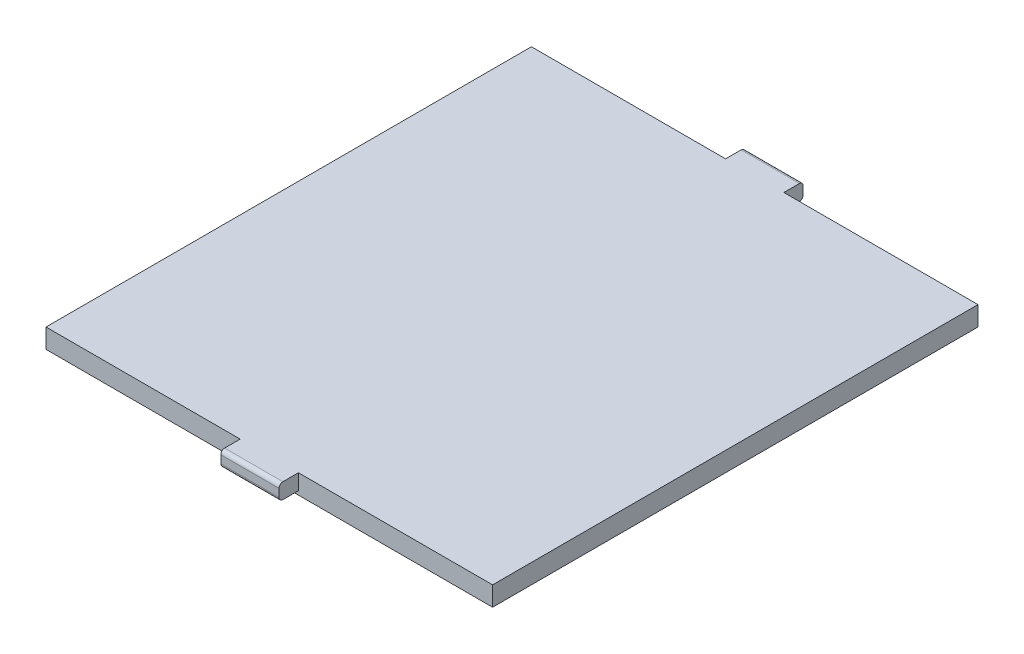
ISO-10303-21;
HEADER;
FILE_DESCRIPTION(('STEP AP214'),'2;1');
FILE_NAME('part.step','',(''),(''),'','','');
FILE_SCHEMA(('AUTOMOTIVE_DESIGN { 1 0 10303 214 1 1 1 1 }'));
ENDSEC;
DATA;
#1=APPLICATION_CONTEXT('core data for automotive mechanical design processes');
#2=APPLICATION_PROTOCOL_DEFINITION('international standard','automotive_design',2000,#1);
#3=PRODUCT_CONTEXT('',#1,'mechanical');
#4=PRODUCT('Part','Part','',(#3));
#5=PRODUCT_RELATED_PRODUCT_CATEGORY('part','',(#4));
#6=PRODUCT_DEFINITION_FORMATION('','',#4);
#7=PRODUCT_DEFINITION_CONTEXT('part definition',#1,'design');
#8=PRODUCT_DEFINITION('design','',#6,#7);
#9=PRODUCT_DEFINITION_SHAPE('','',#8);
#10=(LENGTH_UNIT() NAMED_UNIT(*) SI_UNIT(.MILLI.,.METRE.));
#11=(NAMED_UNIT(*) PLANE_ANGLE_UNIT() SI_UNIT($,.RADIAN.));
#12=(NAMED_UNIT(*) SI_UNIT($,.STERADIAN.) SOLID_ANGLE_UNIT());
#13=UNCERTAINTY_MEASURE_WITH_UNIT(LENGTH_MEASURE(1.E-05),#10,'distance_accuracy_value','');
#14=(GEOMETRIC_REPRESENTATION_CONTEXT(3) GLOBAL_UNCERTAINTY_ASSIGNED_CONTEXT((#13)) GLOBAL_UNIT_ASSIGNED_CONTEXT((#10,
#11,#12)) REPRESENTATION_CONTEXT('',''));
#15=CARTESIAN_POINT('',(0.,0.,0.));
#16=DIRECTION('',(0.,0.,1.));
#17=DIRECTION('',(1.,0.,0.));
#18=AXIS2_PLACEMENT_3D('',#15,#16,#17);
#19=CARTESIAN_POINT('',(0.,25.4,-635.));
#20=DIRECTION('',(0.,0.,1.));
#21=DIRECTION('',(1.,0.,0.));
#22=AXIS2_PLACEMENT_3D('',#19,#20,#21);
#23=PLANE('',#22);
#24=DIRECTION('',(0.,-1.,0.));
#25=VECTOR('',#24,1.);
#26=CARTESIAN_POINT('',(330.2,25.4,-635.));
#27=LINE('',#26,#25);
#28=CARTESIAN_POINT('',(330.2,25.4,-635.));
#29=VERTEX_POINT('',#28);
#30=CARTESIAN_POINT('',(330.2,5.08,-635.));
#31=VERTEX_POINT('',#30);
#32=EDGE_CURVE('E168',#29,#31,#27,.T.);
#33=ORIENTED_EDGE('',*,*,#32,.F.);
#34=DIRECTION('',(-1.,0.,0.));
#35=VECTOR('',#34,1.);
#36=CARTESIAN_POINT('',(0.,25.4,-635.));
#37=LINE('',#36,#35);
#38=CARTESIAN_POINT('',(584.2,25.4,-635.));
#39=VERTEX_POINT('',#38);
#40=EDGE_CURVE('E211',#39,#29,#37,.T.);
#41=ORIENTED_EDGE('',*,*,#40,.F.);
#42=DIRECTION('',(0.,-1.,0.));
#43=VECTOR('',#42,1.);
#44=CARTESIAN_POINT('',(584.2,25.4,-635.));
#45=LINE('',#44,#43);
#46=CARTESIAN_POINT('',(584.2,0.,-635.));
#47=VERTEX_POINT('',#46);
#48=EDGE_CURVE('E224',#39,#47,#45,.T.);
#49=ORIENTED_EDGE('',*,*,#48,.T.);
#50=DIRECTION('',(-1.,0.,0.));
#51=VECTOR('',#50,1.);
#52=CARTESIAN_POINT('',(0.,0.,-635.));
#53=LINE('',#52,#51);
#54=CARTESIAN_POINT('',(0.,0.,-635.));
#55=VERTEX_POINT('',#54);
#56=EDGE_CURVE('E205',#47,#55,#53,.T.);
#57=ORIENTED_EDGE('',*,*,#56,.T.);
#58=DIRECTION('',(0.,-1.,0.));
#59=VECTOR('',#58,1.);
#60=CARTESIAN_POINT('',(0.,25.4,-635.));
#61=LINE('',#60,#59);
#62=CARTESIAN_POINT('',(0.,25.4,-635.));
#63=VERTEX_POINT('',#62);
#64=EDGE_CURVE('E214',#63,#55,#61,.T.);
#65=ORIENTED_EDGE('',*,*,#64,.F.);
#66=CARTESIAN_POINT('',(254.,25.4,-635.));
#67=VERTEX_POINT('',#66);
#68=EDGE_CURVE('E163',#67,#63,#37,.T.);
#69=ORIENTED_EDGE('',*,*,#68,.F.);
#70=DIRECTION('',(0.,1.,0.));
#71=VECTOR('',#70,1.);
#72=CARTESIAN_POINT('',(254.,25.4,-635.));
#73=LINE('',#72,#71);
#74=CARTESIAN_POINT('',(254.,5.08,-635.));
#75=VERTEX_POINT('',#74);
#76=EDGE_CURVE('E148',#75,#67,#73,.T.);
#77=ORIENTED_EDGE('',*,*,#76,.F.);
#78=DIRECTION('',(-1.,0.,0.));
#79=VECTOR('',#78,1.);
#80=CARTESIAN_POINT('',(330.2,5.08,-635.));
#81=LINE('',#80,#79);
#82=EDGE_CURVE('E160',#31,#75,#81,.T.);
#83=ORIENTED_EDGE('',*,*,#82,.F.);
#84=EDGE_LOOP('',(#33,#41,#49,#57,#65,#69,#77,#83));
#85=FACE_BOUND('',#84,.T.);
#86=ADVANCED_FACE('F32',(#85),#23,.F.);
#87=CARTESIAN_POINT('',(0.,25.4,0.));
#88=DIRECTION('',(0.,0.,-1.));
#89=DIRECTION('',(-1.,0.,0.));
#90=AXIS2_PLACEMENT_3D('',#87,#88,#89);
#91=PLANE('',#90);
#92=DIRECTION('',(0.,-1.,0.));
#93=VECTOR('',#92,1.);
#94=CARTESIAN_POINT('',(254.,25.4,0.));
#95=LINE('',#94,#93);
#96=CARTESIAN_POINT('',(254.,25.4,0.));
#97=VERTEX_POINT('',#96);
#98=CARTESIAN_POINT('',(254.,5.08,0.));
#99=VERTEX_POINT('',#98);
#100=EDGE_CURVE('E178',#97,#99,#95,.T.);
#101=ORIENTED_EDGE('',*,*,#100,.F.);
#102=DIRECTION('',(1.,0.,0.));
#103=VECTOR('',#102,1.);
#104=CARTESIAN_POINT('',(0.,25.4,0.));
#105=LINE('',#104,#103);
#106=CARTESIAN_POINT('',(0.,25.4,0.));
#107=VERTEX_POINT('',#106);
#108=EDGE_CURVE('E206',#107,#97,#105,.T.);
#109=ORIENTED_EDGE('',*,*,#108,.F.);
#110=DIRECTION('',(0.,-1.,0.));
#111=VECTOR('',#110,1.);
#112=CARTESIAN_POINT('',(0.,25.4,0.));
#113=LINE('',#112,#111);
#114=CARTESIAN_POINT('',(0.,0.,0.));
#115=VERTEX_POINT('',#114);
#116=EDGE_CURVE('E230',#107,#115,#113,.T.);
#117=ORIENTED_EDGE('',*,*,#116,.T.);
#118=DIRECTION('',(1.,0.,0.));
#119=VECTOR('',#118,1.);
#120=CARTESIAN_POINT('',(0.,0.,0.));
#121=LINE('',#120,#119);
#122=CARTESIAN_POINT('',(584.2,0.,0.));
#123=VERTEX_POINT('',#122);
#124=EDGE_CURVE('E217',#115,#123,#121,.T.);
#125=ORIENTED_EDGE('',*,*,#124,.T.);
#126=DIRECTION('',(0.,-1.,0.));
#127=VECTOR('',#126,1.);
#128=CARTESIAN_POINT('',(584.2,25.4,0.));
#129=LINE('',#128,#127);
#130=CARTESIAN_POINT('',(584.2,25.4,0.));
#131=VERTEX_POINT('',#130);
#132=EDGE_CURVE('E227',#131,#123,#129,.T.);
#133=ORIENTED_EDGE('',*,*,#132,.F.);
#134=CARTESIAN_POINT('',(330.2,25.4,0.));
#135=VERTEX_POINT('',#134);
#136=EDGE_CURVE('E204',#135,#131,#105,.T.);
#137=ORIENTED_EDGE('',*,*,#136,.F.);
#138=DIRECTION('',(0.,1.,0.));
#139=VECTOR('',#138,1.);
#140=CARTESIAN_POINT('',(330.2,25.4,0.));
#141=LINE('',#140,#139);
#142=CARTESIAN_POINT('',(330.2,5.08,0.));
#143=VERTEX_POINT('',#142);
#144=EDGE_CURVE('E182',#143,#135,#141,.T.);
#145=ORIENTED_EDGE('',*,*,#144,.F.);
#146=DIRECTION('',(1.,0.,0.));
#147=VECTOR('',#146,1.);
#148=CARTESIAN_POINT('',(254.,5.08,0.));
#149=LINE('',#148,#147);
#150=EDGE_CURVE('E188',#99,#143,#149,.T.);
#151=ORIENTED_EDGE('',*,*,#150,.F.);
#152=EDGE_LOOP('',(#101,#109,#117,#125,#133,#137,#145,#151));
#153=FACE_BOUND('',#152,.T.);
#154=ADVANCED_FACE('F286',(#153),#91,.F.);
#155=CARTESIAN_POINT('',(0.,25.4,0.));
#156=DIRECTION('',(1.,0.,0.));
#157=DIRECTION('',(0.,0.,-1.));
#158=AXIS2_PLACEMENT_3D('',#155,#156,#157);
#159=PLANE('',#158);
#160=DIRECTION('',(0.,0.,1.));
#161=VECTOR('',#160,1.);
#162=CARTESIAN_POINT('',(0.,0.,0.));
#163=LINE('',#162,#161);
#164=EDGE_CURVE('E200',#55,#115,#163,.T.);
#165=ORIENTED_EDGE('',*,*,#164,.T.);
#166=ORIENTED_EDGE('',*,*,#116,.F.);
#167=DIRECTION('',(0.,0.,1.));
#168=VECTOR('',#167,1.);
#169=CARTESIAN_POINT('',(0.,25.4,0.));
#170=LINE('',#169,#168);
#171=EDGE_CURVE('E201',#63,#107,#170,.T.);
#172=ORIENTED_EDGE('',*,*,#171,.F.);
#173=ORIENTED_EDGE('',*,*,#64,.T.);
#174=EDGE_LOOP('',(#165,#166,#172,#173));
#175=FACE_BOUND('',#174,.T.);
#176=ADVANCED_FACE('F291',(#175),#159,.F.);
#177=CARTESIAN_POINT('',(584.2,25.4,0.));
#178=DIRECTION('',(-1.,0.,0.));
#179=DIRECTION('',(0.,0.,1.));
#180=AXIS2_PLACEMENT_3D('',#177,#178,#179);
#181=PLANE('',#180);
#182=DIRECTION('',(0.,0.,-1.));
#183=VECTOR('',#182,1.);
#184=CARTESIAN_POINT('',(584.2,0.,0.));
#185=LINE('',#184,#183);
#186=EDGE_CURVE('E219',#123,#47,#185,.T.);
#187=ORIENTED_EDGE('',*,*,#186,.T.);
#188=ORIENTED_EDGE('',*,*,#48,.F.);
#189=DIRECTION('',(0.,0.,-1.));
#190=VECTOR('',#189,1.);
#191=CARTESIAN_POINT('',(584.2,25.4,0.));
#192=LINE('',#191,#190);
#193=EDGE_CURVE('E209',#131,#39,#192,.T.);
#194=ORIENTED_EDGE('',*,*,#193,.F.);
#195=ORIENTED_EDGE('',*,*,#132,.T.);
#196=EDGE_LOOP('',(#187,#188,#194,#195));
#197=FACE_BOUND('',#196,.T.);
#198=ADVANCED_FACE('F298',(#197),#181,.F.);
#199=CARTESIAN_POINT('',(0.,25.4,0.));
#200=DIRECTION('',(0.,-1.,0.));
#201=DIRECTION('',(0.,0.,-1.));
#202=AXIS2_PLACEMENT_3D('',#199,#200,#201);
#203=PLANE('',#202);
#204=DIRECTION('',(0.,0.,-1.));
#205=VECTOR('',#204,1.);
#206=CARTESIAN_POINT('',(254.,25.4,25.4));
#207=LINE('',#206,#205);
#208=CARTESIAN_POINT('',(254.,25.4,20.32));
#209=VERTEX_POINT('',#208);
#210=EDGE_CURVE('E185',#209,#97,#207,.T.);
#211=ORIENTED_EDGE('',*,*,#210,.F.);
#212=DIRECTION('',(-1.,0.,0.));
#213=VECTOR('',#212,1.);
#214=CARTESIAN_POINT('',(330.2,25.4,20.32));
#215=LINE('',#214,#213);
#216=CARTESIAN_POINT('',(330.2,25.4,20.32));
#217=VERTEX_POINT('',#216);
#218=EDGE_CURVE('E40',#209,#217,#215,.F.);
#219=ORIENTED_EDGE('',*,*,#218,.T.);
#220=DIRECTION('',(0.,0.,-1.));
#221=VECTOR('',#220,1.);
#222=CARTESIAN_POINT('',(330.2,25.4,25.4));
#223=LINE('',#222,#221);
#224=EDGE_CURVE('E194',#217,#135,#223,.T.);
#225=ORIENTED_EDGE('',*,*,#224,.T.);
#226=ORIENTED_EDGE('',*,*,#136,.T.);
#227=ORIENTED_EDGE('',*,*,#193,.T.);
#228=ORIENTED_EDGE('',*,*,#40,.T.);
#229=DIRECTION('',(0.,0.,1.));
#230=VECTOR('',#229,1.);
#231=CARTESIAN_POINT('',(330.2,25.4,-660.4));
#232=LINE('',#231,#230);
#233=CARTESIAN_POINT('',(330.2,25.4,-655.32));
#234=VERTEX_POINT('',#233);
#235=EDGE_CURVE('E173',#234,#29,#232,.T.);
#236=ORIENTED_EDGE('',*,*,#235,.F.);
#237=DIRECTION('',(1.,0.,0.));
#238=VECTOR('',#237,1.);
#239=CARTESIAN_POINT('',(254.,25.4,-655.32));
#240=LINE('',#239,#238);
#241=CARTESIAN_POINT('',(254.,25.4,-655.32));
#242=VERTEX_POINT('',#241);
#243=EDGE_CURVE('E238',#234,#242,#240,.F.);
#244=ORIENTED_EDGE('',*,*,#243,.T.);
#245=DIRECTION('',(0.,0.,1.));
#246=VECTOR('',#245,1.);
#247=CARTESIAN_POINT('',(254.,25.4,-660.4));
#248=LINE('',#247,#246);
#249=EDGE_CURVE('E154',#242,#67,#248,.T.);
#250=ORIENTED_EDGE('',*,*,#249,.T.);
#251=ORIENTED_EDGE('',*,*,#68,.T.);
#252=ORIENTED_EDGE('',*,*,#171,.T.);
#253=ORIENTED_EDGE('',*,*,#108,.T.);
#254=EDGE_LOOP('',(#211,#219,#225,#226,#227,#228,#236,#244,#250,#251,#252,#253));
#255=FACE_BOUND('',#254,.T.);
#256=ADVANCED_FACE('F300',(#255),#203,.F.);
#257=CARTESIAN_POINT('',(0.,0.,0.));
#258=DIRECTION('',(0.,-1.,0.));
#259=DIRECTION('',(0.,0.,-1.));
#260=AXIS2_PLACEMENT_3D('',#257,#258,#259);
#261=PLANE('',#260);
#262=ORIENTED_EDGE('',*,*,#164,.F.);
#263=ORIENTED_EDGE('',*,*,#56,.F.);
#264=ORIENTED_EDGE('',*,*,#186,.F.);
#265=ORIENTED_EDGE('',*,*,#124,.F.);
#266=EDGE_LOOP('',(#262,#263,#264,#265));
#267=FACE_BOUND('',#266,.T.);
#268=ADVANCED_FACE('F296',(#267),#261,.T.);
#269=CARTESIAN_POINT('',(254.,25.4,25.4));
#270=DIRECTION('',(1.,0.,0.));
#271=DIRECTION('',(0.,0.,-1.));
#272=AXIS2_PLACEMENT_3D('',#269,#270,#271);
#273=PLANE('',#272);
#274=DIRECTION('',(0.,-1.,0.));
#275=VECTOR('',#274,1.);
#276=CARTESIAN_POINT('',(254.,25.4,25.4));
#277=LINE('',#276,#275);
#278=CARTESIAN_POINT('',(254.,20.32,25.4));
#279=VERTEX_POINT('',#278);
#280=CARTESIAN_POINT('',(254.,10.16,25.4));
#281=VERTEX_POINT('',#280);
#282=EDGE_CURVE('E179',#279,#281,#277,.T.);
#283=ORIENTED_EDGE('',*,*,#282,.F.);
#284=CARTESIAN_POINT('',(254.,20.32,20.32));
#285=DIRECTION('',(1.,0.,0.));
#286=DIRECTION('',(0.,0.,-1.));
#287=AXIS2_PLACEMENT_3D('',#284,#285,#286);
#288=CIRCLE('',#287,5.08);
#289=EDGE_CURVE('E54',#279,#209,#288,.F.);
#290=ORIENTED_EDGE('',*,*,#289,.T.);
#291=ORIENTED_EDGE('',*,*,#210,.T.);
#292=ORIENTED_EDGE('',*,*,#100,.T.);
#293=DIRECTION('',(0.,0.,-1.));
#294=VECTOR('',#293,1.);
#295=CARTESIAN_POINT('',(254.,5.08,25.4));
#296=LINE('',#295,#294);
#297=CARTESIAN_POINT('',(254.,5.08,20.32));
#298=VERTEX_POINT('',#297);
#299=EDGE_CURVE('E198',#298,#99,#296,.T.);
#300=ORIENTED_EDGE('',*,*,#299,.F.);
#301=CARTESIAN_POINT('',(254.,10.16,20.32));
#302=DIRECTION('',(1.,0.,0.));
#303=DIRECTION('',(0.,0.,-1.));
#304=AXIS2_PLACEMENT_3D('',#301,#302,#303);
#305=CIRCLE('',#304,5.08);
#306=EDGE_CURVE('E258',#298,#281,#305,.F.);
#307=ORIENTED_EDGE('',*,*,#306,.T.);
#308=EDGE_LOOP('',(#283,#290,#291,#292,#300,#307));
#309=FACE_BOUND('',#308,.T.);
#310=ADVANCED_FACE('F270',(#309),#273,.F.);
#311=CARTESIAN_POINT('',(254.,5.08,25.4));
#312=DIRECTION('',(0.,1.,0.));
#313=DIRECTION('',(0.,0.,1.));
#314=AXIS2_PLACEMENT_3D('',#311,#312,#313);
#315=PLANE('',#314);
#316=DIRECTION('',(0.,0.,-1.));
#317=VECTOR('',#316,1.);
#318=CARTESIAN_POINT('',(330.2,5.08,25.4));
#319=LINE('',#318,#317);
#320=CARTESIAN_POINT('',(330.2,5.08,20.32));
#321=VERTEX_POINT('',#320);
#322=EDGE_CURVE('E196',#321,#143,#319,.T.);
#323=ORIENTED_EDGE('',*,*,#322,.F.);
#324=DIRECTION('',(1.,0.,0.));
#325=VECTOR('',#324,1.);
#326=CARTESIAN_POINT('',(254.,5.08,20.32));
#327=LINE('',#326,#325);
#328=EDGE_CURVE('E256',#321,#298,#327,.F.);
#329=ORIENTED_EDGE('',*,*,#328,.T.);
#330=ORIENTED_EDGE('',*,*,#299,.T.);
#331=ORIENTED_EDGE('',*,*,#150,.T.);
#332=EDGE_LOOP('',(#323,#329,#330,#331));
#333=FACE_BOUND('',#332,.T.);
#334=ADVANCED_FACE('F341',(#333),#315,.F.);
#335=CARTESIAN_POINT('',(330.2,25.4,25.4));
#336=DIRECTION('',(-1.,0.,0.));
#337=DIRECTION('',(0.,0.,1.));
#338=AXIS2_PLACEMENT_3D('',#335,#336,#337);
#339=PLANE('',#338);
#340=ORIENTED_EDGE('',*,*,#224,.F.);
#341=CARTESIAN_POINT('',(330.2,20.32,20.32));
#342=DIRECTION('',(-1.,0.,0.));
#343=DIRECTION('',(0.,0.,1.));
#344=AXIS2_PLACEMENT_3D('',#341,#342,#343);
#345=CIRCLE('',#344,5.08);
#346=CARTESIAN_POINT('',(330.2,20.32,25.4));
#347=VERTEX_POINT('',#346);
#348=EDGE_CURVE('E11',#217,#347,#345,.F.);
#349=ORIENTED_EDGE('',*,*,#348,.T.);
#350=DIRECTION('',(0.,1.,0.));
#351=VECTOR('',#350,1.);
#352=CARTESIAN_POINT('',(330.2,25.4,25.4));
#353=LINE('',#352,#351);
#354=CARTESIAN_POINT('',(330.2,10.16,25.4));
#355=VERTEX_POINT('',#354);
#356=EDGE_CURVE('E181',#355,#347,#353,.T.);
#357=ORIENTED_EDGE('',*,*,#356,.F.);
#358=CARTESIAN_POINT('',(330.2,10.16,20.32));
#359=DIRECTION('',(-1.,0.,0.));
#360=DIRECTION('',(0.,0.,1.));
#361=AXIS2_PLACEMENT_3D('',#358,#359,#360);
#362=CIRCLE('',#361,5.08);
#363=EDGE_CURVE('E254',#355,#321,#362,.F.);
#364=ORIENTED_EDGE('',*,*,#363,.T.);
#365=ORIENTED_EDGE('',*,*,#322,.T.);
#366=ORIENTED_EDGE('',*,*,#144,.T.);
#367=EDGE_LOOP('',(#340,#349,#357,#364,#365,#366));
#368=FACE_BOUND('',#367,.T.);
#369=ADVANCED_FACE('F278',(#368),#339,.F.);
#370=CARTESIAN_POINT('',(0.,0.,25.4));
#371=DIRECTION('',(0.,0.,1.));
#372=DIRECTION('',(1.,0.,0.));
#373=AXIS2_PLACEMENT_3D('',#370,#371,#372);
#374=PLANE('',#373);
#375=ORIENTED_EDGE('',*,*,#356,.T.);
#376=DIRECTION('',(-1.,0.,0.));
#377=VECTOR('',#376,1.);
#378=CARTESIAN_POINT('',(254.,20.32,25.4));
#379=LINE('',#378,#377);
#380=EDGE_CURVE('E261',#347,#279,#379,.T.);
#381=ORIENTED_EDGE('',*,*,#380,.T.);
#382=ORIENTED_EDGE('',*,*,#282,.T.);
#383=DIRECTION('',(1.,0.,0.));
#384=VECTOR('',#383,1.);
#385=CARTESIAN_POINT('',(330.2,10.16,25.4));
#386=LINE('',#385,#384);
#387=EDGE_CURVE('E251',#281,#355,#386,.T.);
#388=ORIENTED_EDGE('',*,*,#387,.T.);
#389=EDGE_LOOP('',(#375,#381,#382,#388));
#390=FACE_BOUND('',#389,.T.);
#391=ADVANCED_FACE('F266',(#390),#374,.T.);
#392=CARTESIAN_POINT('',(330.2,25.4,-660.4));
#393=DIRECTION('',(-1.,0.,0.));
#394=DIRECTION('',(0.,0.,1.));
#395=AXIS2_PLACEMENT_3D('',#392,#393,#394);
#396=PLANE('',#395);
#397=DIRECTION('',(0.,0.,1.));
#398=VECTOR('',#397,1.);
#399=CARTESIAN_POINT('',(330.2,5.08,-660.4));
#400=LINE('',#399,#398);
#401=CARTESIAN_POINT('',(330.2,5.08,-655.32));
#402=VERTEX_POINT('',#401);
#403=EDGE_CURVE('E153',#402,#31,#400,.T.);
#404=ORIENTED_EDGE('',*,*,#403,.F.);
#405=CARTESIAN_POINT('',(330.2,10.16,-655.32));
#406=DIRECTION('',(-1.,0.,0.));
#407=DIRECTION('',(0.,0.,1.));
#408=AXIS2_PLACEMENT_3D('',#405,#406,#407);
#409=CIRCLE('',#408,5.08);
#410=CARTESIAN_POINT('',(330.2,10.16,-660.4));
#411=VERTEX_POINT('',#410);
#412=EDGE_CURVE('E249',#402,#411,#409,.F.);
#413=ORIENTED_EDGE('',*,*,#412,.T.);
#414=DIRECTION('',(0.,-1.,0.));
#415=VECTOR('',#414,1.);
#416=CARTESIAN_POINT('',(330.2,25.4,-660.4));
#417=LINE('',#416,#415);
#418=CARTESIAN_POINT('',(330.2,20.32,-660.4));
#419=VERTEX_POINT('',#418);
#420=EDGE_CURVE('E164',#419,#411,#417,.T.);
#421=ORIENTED_EDGE('',*,*,#420,.F.);
#422=CARTESIAN_POINT('',(330.2,20.32,-655.32));
#423=DIRECTION('',(-1.,0.,0.));
#424=DIRECTION('',(0.,0.,1.));
#425=AXIS2_PLACEMENT_3D('',#422,#423,#424);
#426=CIRCLE('',#425,5.08);
#427=EDGE_CURVE('E236',#419,#234,#426,.F.);
#428=ORIENTED_EDGE('',*,*,#427,.T.);
#429=ORIENTED_EDGE('',*,*,#235,.T.);
#430=ORIENTED_EDGE('',*,*,#32,.T.);
#431=EDGE_LOOP('',(#404,#413,#421,#428,#429,#430));
#432=FACE_BOUND('',#431,.T.);
#433=ADVANCED_FACE('F320',(#432),#396,.F.);
#434=CARTESIAN_POINT('',(330.2,5.08,-660.4));
#435=DIRECTION('',(0.,1.,0.));
#436=DIRECTION('',(0.,0.,1.));
#437=AXIS2_PLACEMENT_3D('',#434,#435,#436);
#438=PLANE('',#437);
#439=DIRECTION('',(0.,0.,1.));
#440=VECTOR('',#439,1.);
#441=CARTESIAN_POINT('',(254.,5.08,-660.4));
#442=LINE('',#441,#440);
#443=CARTESIAN_POINT('',(254.,5.08,-655.32));
#444=VERTEX_POINT('',#443);
#445=EDGE_CURVE('E143',#444,#75,#442,.T.);
#446=ORIENTED_EDGE('',*,*,#445,.F.);
#447=DIRECTION('',(-1.,0.,0.));
#448=VECTOR('',#447,1.);
#449=CARTESIAN_POINT('',(330.2,5.08,-655.32));
#450=LINE('',#449,#448);
#451=EDGE_CURVE('E247',#444,#402,#450,.F.);
#452=ORIENTED_EDGE('',*,*,#451,.T.);
#453=ORIENTED_EDGE('',*,*,#403,.T.);
#454=ORIENTED_EDGE('',*,*,#82,.T.);
#455=EDGE_LOOP('',(#446,#452,#453,#454));
#456=FACE_BOUND('',#455,.T.);
#457=ADVANCED_FACE('F166',(#456),#438,.F.);
#458=CARTESIAN_POINT('',(254.,25.4,-660.4));
#459=DIRECTION('',(1.,0.,0.));
#460=DIRECTION('',(0.,0.,-1.));
#461=AXIS2_PLACEMENT_3D('',#458,#459,#460);
#462=PLANE('',#461);
#463=DIRECTION('',(0.,1.,0.));
#464=VECTOR('',#463,1.);
#465=CARTESIAN_POINT('',(254.,25.4,-660.4));
#466=LINE('',#465,#464);
#467=CARTESIAN_POINT('',(254.,10.16,-660.4));
#468=VERTEX_POINT('',#467);
#469=CARTESIAN_POINT('',(254.,20.32,-660.4));
#470=VERTEX_POINT('',#469);
#471=EDGE_CURVE('E175',#468,#470,#466,.T.);
#472=ORIENTED_EDGE('',*,*,#471,.F.);
#473=CARTESIAN_POINT('',(254.,10.16,-655.32));
#474=DIRECTION('',(1.,0.,0.));
#475=DIRECTION('',(0.,0.,-1.));
#476=AXIS2_PLACEMENT_3D('',#473,#474,#475);
#477=CIRCLE('',#476,5.08);
#478=EDGE_CURVE('E149',#468,#444,#477,.F.);
#479=ORIENTED_EDGE('',*,*,#478,.T.);
#480=ORIENTED_EDGE('',*,*,#445,.T.);
#481=ORIENTED_EDGE('',*,*,#76,.T.);
#482=ORIENTED_EDGE('',*,*,#249,.F.);
#483=CARTESIAN_POINT('',(254.,20.32,-655.32));
#484=DIRECTION('',(1.,0.,0.));
#485=DIRECTION('',(0.,0.,-1.));
#486=AXIS2_PLACEMENT_3D('',#483,#484,#485);
#487=CIRCLE('',#486,5.08);
#488=EDGE_CURVE('E240',#242,#470,#487,.F.);
#489=ORIENTED_EDGE('',*,*,#488,.T.);
#490=EDGE_LOOP('',(#472,#479,#480,#481,#482,#489));
#491=FACE_BOUND('',#490,.T.);
#492=ADVANCED_FACE('F146',(#491),#462,.F.);
#493=CARTESIAN_POINT('',(0.,0.,-660.4));
#494=DIRECTION('',(0.,0.,-1.));
#495=DIRECTION('',(-1.,0.,0.));
#496=AXIS2_PLACEMENT_3D('',#493,#494,#495);
#497=PLANE('',#496);
#498=ORIENTED_EDGE('',*,*,#420,.T.);
#499=DIRECTION('',(-1.,0.,0.));
#500=VECTOR('',#499,1.);
#501=CARTESIAN_POINT('',(254.,10.16,-660.4));
#502=LINE('',#501,#500);
#503=EDGE_CURVE('E243',#411,#468,#502,.T.);
#504=ORIENTED_EDGE('',*,*,#503,.T.);
#505=ORIENTED_EDGE('',*,*,#471,.T.);
#506=DIRECTION('',(1.,0.,0.));
#507=VECTOR('',#506,1.);
#508=CARTESIAN_POINT('',(330.2,20.32,-660.4));
#509=LINE('',#508,#507);
#510=EDGE_CURVE('E233',#470,#419,#509,.T.);
#511=ORIENTED_EDGE('',*,*,#510,.T.);
#512=EDGE_LOOP('',(#498,#504,#505,#511));
#513=FACE_BOUND('',#512,.T.);
#514=ADVANCED_FACE('F309',(#513),#497,.T.);
#515=CARTESIAN_POINT('',(0.,20.32,-655.32));
#516=DIRECTION('',(-1.,0.,0.));
#517=DIRECTION('',(0.,0.,1.));
#518=AXIS2_PLACEMENT_3D('',#515,#516,#517);
#519=CYLINDRICAL_SURFACE('',#518,5.08);
#520=ORIENTED_EDGE('',*,*,#488,.F.);
#521=ORIENTED_EDGE('',*,*,#243,.F.);
#522=ORIENTED_EDGE('',*,*,#427,.F.);
#523=ORIENTED_EDGE('',*,*,#510,.F.);
#524=EDGE_LOOP('',(#520,#521,#522,#523));
#525=FACE_BOUND('',#524,.T.);
#526=ADVANCED_FACE('F306',(#525),#519,.T.);
#527=CARTESIAN_POINT('',(0.,10.16,-655.32));
#528=DIRECTION('',(1.,0.,0.));
#529=DIRECTION('',(0.,0.,-1.));
#530=AXIS2_PLACEMENT_3D('',#527,#528,#529);
#531=CYLINDRICAL_SURFACE('',#530,5.08);
#532=ORIENTED_EDGE('',*,*,#412,.F.);
#533=ORIENTED_EDGE('',*,*,#451,.F.);
#534=ORIENTED_EDGE('',*,*,#478,.F.);
#535=ORIENTED_EDGE('',*,*,#503,.F.);
#536=EDGE_LOOP('',(#532,#533,#534,#535));
#537=FACE_BOUND('',#536,.T.);
#538=ADVANCED_FACE('F284',(#537),#531,.T.);
#539=CARTESIAN_POINT('',(0.,10.16,20.32));
#540=DIRECTION('',(-1.,0.,0.));
#541=DIRECTION('',(0.,0.,1.));
#542=AXIS2_PLACEMENT_3D('',#539,#540,#541);
#543=CYLINDRICAL_SURFACE('',#542,5.08);
#544=ORIENTED_EDGE('',*,*,#306,.F.);
#545=ORIENTED_EDGE('',*,*,#328,.F.);
#546=ORIENTED_EDGE('',*,*,#363,.F.);
#547=ORIENTED_EDGE('',*,*,#387,.F.);
#548=EDGE_LOOP('',(#544,#545,#546,#547));
#549=FACE_BOUND('',#548,.T.);
#550=ADVANCED_FACE('F276',(#549),#543,.T.);
#551=CARTESIAN_POINT('',(0.,20.32,20.32));
#552=DIRECTION('',(1.,0.,0.));
#553=DIRECTION('',(0.,0.,-1.));
#554=AXIS2_PLACEMENT_3D('',#551,#552,#553);
#555=CYLINDRICAL_SURFACE('',#554,5.08);
#556=ORIENTED_EDGE('',*,*,#348,.F.);
#557=ORIENTED_EDGE('',*,*,#218,.F.);
#558=ORIENTED_EDGE('',*,*,#289,.F.);
#559=ORIENTED_EDGE('',*,*,#380,.F.);
#560=EDGE_LOOP('',(#556,#557,#558,#559));
#561=FACE_BOUND('',#560,.T.);
#562=ADVANCED_FACE('F34',(#561),#555,.T.);
#563=CLOSED_SHELL('',(#86,#154,#176,#198,#256,#268,#310,#334,#369,#391,#433,#457,#492,#514,#526,
#538,#550,#562));
#564=MANIFOLD_SOLID_BREP('B2',#563);
#565=ADVANCED_BREP_SHAPE_REPRESENTATION('',(#18,#564),#14);
#566=SHAPE_DEFINITION_REPRESENTATION(#9,#565);
ENDSEC;
END-ISO-10303-21;
